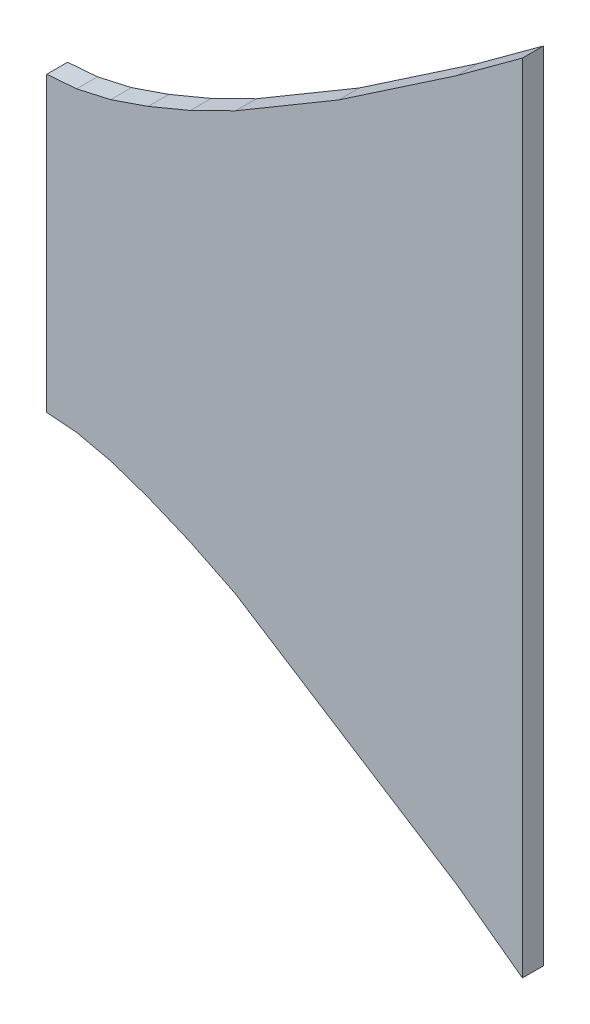
ISO-10303-21;
HEADER;
FILE_DESCRIPTION(('STEP AP214'),'2;1');
FILE_NAME('part.step','',(''),(''),'','','');
FILE_SCHEMA(('AUTOMOTIVE_DESIGN { 1 0 10303 214 1 1 1 1 }'));
ENDSEC;
DATA;
#1=APPLICATION_CONTEXT('core data for automotive mechanical design processes');
#2=APPLICATION_PROTOCOL_DEFINITION('international standard','automotive_design',2000,#1);
#3=PRODUCT_CONTEXT('',#1,'mechanical');
#4=PRODUCT('Part','Part','',(#3));
#5=PRODUCT_RELATED_PRODUCT_CATEGORY('part','',(#4));
#6=PRODUCT_DEFINITION_FORMATION('','',#4);
#7=PRODUCT_DEFINITION_CONTEXT('part definition',#1,'design');
#8=PRODUCT_DEFINITION('design','',#6,#7);
#9=PRODUCT_DEFINITION_SHAPE('','',#8);
#10=(LENGTH_UNIT() NAMED_UNIT(*) SI_UNIT(.MILLI.,.METRE.));
#11=(NAMED_UNIT(*) PLANE_ANGLE_UNIT() SI_UNIT($,.RADIAN.));
#12=(NAMED_UNIT(*) SI_UNIT($,.STERADIAN.) SOLID_ANGLE_UNIT());
#13=UNCERTAINTY_MEASURE_WITH_UNIT(LENGTH_MEASURE(1.E-05),#10,'distance_accuracy_value','');
#14=(GEOMETRIC_REPRESENTATION_CONTEXT(3) GLOBAL_UNCERTAINTY_ASSIGNED_CONTEXT((#13)) GLOBAL_UNIT_ASSIGNED_CONTEXT((#10,
#11,#12)) REPRESENTATION_CONTEXT('',''));
#15=CARTESIAN_POINT('',(0.,0.,0.));
#16=DIRECTION('',(0.,0.,1.));
#17=DIRECTION('',(1.,0.,0.));
#18=AXIS2_PLACEMENT_3D('',#15,#16,#17);
#19=CARTESIAN_POINT('',(115.977996826172,79.3099975585938,0.));
#20=DIRECTION('',(0.0781447450221444,0.996942023803503,0.));
#21=DIRECTION('',(0.996942023803503,-0.0781447450221444,0.));
#22=AXIS2_PLACEMENT_3D('',#19,#20,#21);
#23=PLANE('',#22);
#24=DIRECTION('',(0.996942023803503,-0.0781447450221444,0.));
#25=VECTOR('',#24,1.);
#26=CARTESIAN_POINT('',(115.977996826172,79.3099975585938,0.03556));
#27=LINE('',#26,#25);
#28=CARTESIAN_POINT('',(115.977996826172,79.3099975585938,0.03556));
#29=VERTEX_POINT('',#28);
#30=CARTESIAN_POINT('',(116.028999328613,79.3059997558594,0.03556));
#31=VERTEX_POINT('',#30);
#32=EDGE_CURVE('E11',#29,#31,#27,.T.);
#33=ORIENTED_EDGE('',*,*,#32,.F.);
#34=DIRECTION('',(0.,0.,1.));
#35=VECTOR('',#34,1.);
#36=CARTESIAN_POINT('',(115.977996826172,79.3099975585938,0.));
#37=LINE('',#36,#35);
#38=CARTESIAN_POINT('',(115.977996826172,79.3099975585938,0.));
#39=VERTEX_POINT('',#38);
#40=EDGE_CURVE('E24',#39,#29,#37,.T.);
#41=ORIENTED_EDGE('',*,*,#40,.F.);
#42=DIRECTION('',(0.996942023803503,-0.0781447450221444,0.));
#43=VECTOR('',#42,1.);
#44=CARTESIAN_POINT('',(115.977996826172,79.3099975585938,0.));
#45=LINE('',#44,#43);
#46=CARTESIAN_POINT('',(116.028999328613,79.3059997558594,0.));
#47=VERTEX_POINT('',#46);
#48=EDGE_CURVE('E154',#39,#47,#45,.T.);
#49=ORIENTED_EDGE('',*,*,#48,.T.);
#50=DIRECTION('',(0.,0.,1.));
#51=VECTOR('',#50,1.);
#52=CARTESIAN_POINT('',(116.028999328613,79.3059997558594,0.));
#53=LINE('',#52,#51);
#54=EDGE_CURVE('E37',#47,#31,#53,.T.);
#55=ORIENTED_EDGE('',*,*,#54,.T.);
#56=EDGE_LOOP('',(#33,#41,#49,#55));
#57=FACE_BOUND('',#56,.T.);
#58=ADVANCED_FACE('F17',(#57),#23,.F.);
#59=CARTESIAN_POINT('',(116.028999328613,79.3059997558594,0.));
#60=DIRECTION('',(0.218724100263412,0.97578674307656,0.));
#61=DIRECTION('',(0.97578674307656,-0.218724100263412,0.));
#62=AXIS2_PLACEMENT_3D('',#59,#60,#61);
#63=PLANE('',#62);
#64=DIRECTION('',(0.97578674307656,-0.218724100263412,0.));
#65=VECTOR('',#64,1.);
#66=CARTESIAN_POINT('',(116.028999328613,79.3059997558594,0.03556));
#67=LINE('',#66,#65);
#68=CARTESIAN_POINT('',(116.08699798584,79.2929992675781,0.03556));
#69=VERTEX_POINT('',#68);
#70=EDGE_CURVE('E266',#31,#69,#67,.T.);
#71=ORIENTED_EDGE('',*,*,#70,.F.);
#72=ORIENTED_EDGE('',*,*,#54,.F.);
#73=DIRECTION('',(0.97578674307656,-0.218724100263412,0.));
#74=VECTOR('',#73,1.);
#75=CARTESIAN_POINT('',(116.028999328613,79.3059997558594,0.));
#76=LINE('',#75,#74);
#77=CARTESIAN_POINT('',(116.08699798584,79.2929992675781,0.));
#78=VERTEX_POINT('',#77);
#79=EDGE_CURVE('E263',#47,#78,#76,.T.);
#80=ORIENTED_EDGE('',*,*,#79,.T.);
#81=DIRECTION('',(0.,0.,1.));
#82=VECTOR('',#81,1.);
#83=CARTESIAN_POINT('',(116.08699798584,79.2929992675781,0.));
#84=LINE('',#83,#82);
#85=EDGE_CURVE('E261',#78,#69,#84,.T.);
#86=ORIENTED_EDGE('',*,*,#85,.T.);
#87=EDGE_LOOP('',(#71,#72,#80,#86));
#88=FACE_BOUND('',#87,.T.);
#89=ADVANCED_FACE('F274',(#88),#63,.F.);
#90=CARTESIAN_POINT('',(116.08699798584,79.2929992675781,0.));
#91=DIRECTION('',(0.325007303806511,0.945711505942707,0.));
#92=DIRECTION('',(0.945711505942707,-0.325007303806511,0.));
#93=AXIS2_PLACEMENT_3D('',#90,#91,#92);
#94=PLANE('',#93);
#95=DIRECTION('',(0.945711505942707,-0.325007303806511,0.));
#96=VECTOR('',#95,1.);
#97=CARTESIAN_POINT('',(116.08699798584,79.2929992675781,0.03556));
#98=LINE('',#97,#96);
#99=CARTESIAN_POINT('',(116.151000976562,79.2710037231445,0.03556));
#100=VERTEX_POINT('',#99);
#101=EDGE_CURVE('E258',#69,#100,#98,.T.);
#102=ORIENTED_EDGE('',*,*,#101,.F.);
#103=ORIENTED_EDGE('',*,*,#85,.F.);
#104=DIRECTION('',(0.945711505942707,-0.325007303806511,0.));
#105=VECTOR('',#104,1.);
#106=CARTESIAN_POINT('',(116.08699798584,79.2929992675781,0.));
#107=LINE('',#106,#105);
#108=CARTESIAN_POINT('',(116.151000976562,79.2710037231445,0.));
#109=VERTEX_POINT('',#108);
#110=EDGE_CURVE('E255',#78,#109,#107,.T.);
#111=ORIENTED_EDGE('',*,*,#110,.T.);
#112=DIRECTION('',(0.,0.,1.));
#113=VECTOR('',#112,1.);
#114=CARTESIAN_POINT('',(116.151000976562,79.2710037231445,0.));
#115=LINE('',#114,#113);
#116=EDGE_CURVE('E253',#109,#100,#115,.T.);
#117=ORIENTED_EDGE('',*,*,#116,.T.);
#118=EDGE_LOOP('',(#102,#103,#111,#117));
#119=FACE_BOUND('',#118,.T.);
#120=ADVANCED_FACE('F280',(#119),#94,.F.);
#121=CARTESIAN_POINT('',(116.151000976562,79.2710037231445,0.));
#122=DIRECTION('',(0.384691780277399,0.923045087840787,0.));
#123=DIRECTION('',(0.923045087840787,-0.384691780277399,0.));
#124=AXIS2_PLACEMENT_3D('',#121,#122,#123);
#125=PLANE('',#124);
#126=DIRECTION('',(0.923045087840787,-0.384691780277399,0.));
#127=VECTOR('',#126,1.);
#128=CARTESIAN_POINT('',(116.151000976562,79.2710037231445,0.03556));
#129=LINE('',#128,#127);
#130=CARTESIAN_POINT('',(116.222999572754,79.2409973144531,0.03556));
#131=VERTEX_POINT('',#130);
#132=EDGE_CURVE('E250',#100,#131,#129,.T.);
#133=ORIENTED_EDGE('',*,*,#132,.F.);
#134=ORIENTED_EDGE('',*,*,#116,.F.);
#135=DIRECTION('',(0.923045087840787,-0.384691780277399,0.));
#136=VECTOR('',#135,1.);
#137=CARTESIAN_POINT('',(116.151000976562,79.2710037231445,0.));
#138=LINE('',#137,#136);
#139=CARTESIAN_POINT('',(116.222999572754,79.2409973144531,0.));
#140=VERTEX_POINT('',#139);
#141=EDGE_CURVE('E247',#109,#140,#138,.T.);
#142=ORIENTED_EDGE('',*,*,#141,.T.);
#143=DIRECTION('',(0.,0.,1.));
#144=VECTOR('',#143,1.);
#145=CARTESIAN_POINT('',(116.222999572754,79.2409973144531,0.));
#146=LINE('',#145,#144);
#147=EDGE_CURVE('E245',#140,#131,#146,.T.);
#148=ORIENTED_EDGE('',*,*,#147,.T.);
#149=EDGE_LOOP('',(#133,#134,#142,#148));
#150=FACE_BOUND('',#149,.T.);
#151=ADVANCED_FACE('F282',(#150),#125,.F.);
#152=CARTESIAN_POINT('',(116.222999572754,79.2409973144531,0.));
#153=DIRECTION('',(0.442480450642738,0.896778150268504,0.));
#154=DIRECTION('',(0.896778150268504,-0.442480450642738,0.));
#155=AXIS2_PLACEMENT_3D('',#152,#153,#154);
#156=PLANE('',#155);
#157=DIRECTION('',(0.896778150268504,-0.442480450642738,0.));
#158=VECTOR('',#157,1.);
#159=CARTESIAN_POINT('',(116.222999572754,79.2409973144531,0.03556));
#160=LINE('',#159,#158);
#161=CARTESIAN_POINT('',(116.300003051758,79.2030029296875,0.03556));
#162=VERTEX_POINT('',#161);
#163=EDGE_CURVE('E242',#131,#162,#160,.T.);
#164=ORIENTED_EDGE('',*,*,#163,.F.);
#165=ORIENTED_EDGE('',*,*,#147,.F.);
#166=DIRECTION('',(0.896778150268504,-0.442480450642738,0.));
#167=VECTOR('',#166,1.);
#168=CARTESIAN_POINT('',(116.222999572754,79.2409973144531,0.));
#169=LINE('',#168,#167);
#170=CARTESIAN_POINT('',(116.300003051758,79.2030029296875,0.));
#171=VERTEX_POINT('',#170);
#172=EDGE_CURVE('E239',#140,#171,#169,.T.);
#173=ORIENTED_EDGE('',*,*,#172,.T.);
#174=DIRECTION('',(0.,0.,1.));
#175=VECTOR('',#174,1.);
#176=CARTESIAN_POINT('',(116.300003051758,79.2030029296875,0.));
#177=LINE('',#176,#175);
#178=EDGE_CURVE('E237',#171,#162,#177,.T.);
#179=ORIENTED_EDGE('',*,*,#178,.T.);
#180=EDGE_LOOP('',(#164,#165,#173,#179));
#181=FACE_BOUND('',#180,.T.);
#182=ADVANCED_FACE('F287',(#181),#156,.F.);
#183=CARTESIAN_POINT('',(116.300003051758,79.2030029296875,0.));
#184=DIRECTION('',(0.537606497773678,0.843195857171702,0.));
#185=DIRECTION('',(0.843195857171701,-0.537606497773678,0.));
#186=AXIS2_PLACEMENT_3D('',#183,#184,#185);
#187=PLANE('',#186);
#188=DIRECTION('',(0.843195857171702,-0.537606497773678,0.));
#189=VECTOR('',#188,1.);
#190=CARTESIAN_POINT('',(116.300003051758,79.2030029296875,0.03556));
#191=LINE('',#190,#189);
#192=CARTESIAN_POINT('',(116.678001403809,78.9619979858398,0.03556));
#193=VERTEX_POINT('',#192);
#194=EDGE_CURVE('E234',#162,#193,#191,.T.);
#195=ORIENTED_EDGE('',*,*,#194,.F.);
#196=ORIENTED_EDGE('',*,*,#178,.F.);
#197=DIRECTION('',(0.843195857171702,-0.537606497773678,0.));
#198=VECTOR('',#197,1.);
#199=CARTESIAN_POINT('',(116.300003051758,79.2030029296875,0.));
#200=LINE('',#199,#198);
#201=CARTESIAN_POINT('',(116.678001403809,78.9619979858398,0.));
#202=VERTEX_POINT('',#201);
#203=EDGE_CURVE('E231',#171,#202,#200,.T.);
#204=ORIENTED_EDGE('',*,*,#203,.T.);
#205=DIRECTION('',(0.,0.,1.));
#206=VECTOR('',#205,1.);
#207=CARTESIAN_POINT('',(116.678001403809,78.9619979858398,0.));
#208=LINE('',#207,#206);
#209=EDGE_CURVE('E229',#202,#193,#208,.T.);
#210=ORIENTED_EDGE('',*,*,#209,.T.);
#211=EDGE_LOOP('',(#195,#196,#204,#210));
#212=FACE_BOUND('',#211,.T.);
#213=ADVANCED_FACE('F290',(#212),#187,.F.);
#214=CARTESIAN_POINT('',(116.678001403809,78.9619979858398,0.));
#215=DIRECTION('',(0.590743962247607,0.806859077576746,0.));
#216=DIRECTION('',(0.806859077576746,-0.590743962247607,0.));
#217=AXIS2_PLACEMENT_3D('',#214,#215,#216);
#218=PLANE('',#217);
#219=DIRECTION('',(0.806859077576746,-0.590743962247607,0.));
#220=VECTOR('',#219,1.);
#221=CARTESIAN_POINT('',(116.678001403809,78.9619979858398,0.03556));
#222=LINE('',#221,#220);
#223=CARTESIAN_POINT('',(116.790000915527,78.879997253418,0.03556));
#224=VERTEX_POINT('',#223);
#225=EDGE_CURVE('E226',#193,#224,#222,.T.);
#226=ORIENTED_EDGE('',*,*,#225,.F.);
#227=ORIENTED_EDGE('',*,*,#209,.F.);
#228=DIRECTION('',(0.806859077576746,-0.590743962247607,0.));
#229=VECTOR('',#228,1.);
#230=CARTESIAN_POINT('',(116.678001403809,78.9619979858398,0.));
#231=LINE('',#230,#229);
#232=CARTESIAN_POINT('',(116.790000915527,78.879997253418,0.));
#233=VERTEX_POINT('',#232);
#234=EDGE_CURVE('E223',#202,#233,#231,.T.);
#235=ORIENTED_EDGE('',*,*,#234,.T.);
#236=DIRECTION('',(0.,0.,1.));
#237=VECTOR('',#236,1.);
#238=CARTESIAN_POINT('',(116.790000915527,78.879997253418,0.));
#239=LINE('',#238,#237);
#240=EDGE_CURVE('E221',#233,#224,#239,.T.);
#241=ORIENTED_EDGE('',*,*,#240,.T.);
#242=EDGE_LOOP('',(#226,#227,#235,#241));
#243=FACE_BOUND('',#242,.T.);
#244=ADVANCED_FACE('F295',(#243),#218,.F.);
#245=CARTESIAN_POINT('',(116.790000915527,78.879997253418,0.));
#246=DIRECTION('',(-1.,0.,0.));
#247=DIRECTION('',(0.,1.,0.));
#248=AXIS2_PLACEMENT_3D('',#245,#246,#247);
#249=PLANE('',#248);
#250=DIRECTION('',(0.,1.,0.));
#251=VECTOR('',#250,1.);
#252=CARTESIAN_POINT('',(116.790000915527,78.879997253418,0.03556));
#253=LINE('',#252,#251);
#254=CARTESIAN_POINT('',(116.790000915527,80.2399978637695,0.03556));
#255=VERTEX_POINT('',#254);
#256=EDGE_CURVE('E218',#224,#255,#253,.T.);
#257=ORIENTED_EDGE('',*,*,#256,.F.);
#258=ORIENTED_EDGE('',*,*,#240,.F.);
#259=DIRECTION('',(0.,1.,0.));
#260=VECTOR('',#259,1.);
#261=CARTESIAN_POINT('',(116.790000915527,78.879997253418,0.));
#262=LINE('',#261,#260);
#263=CARTESIAN_POINT('',(116.790000915527,80.2399978637695,0.));
#264=VERTEX_POINT('',#263);
#265=EDGE_CURVE('E215',#233,#264,#262,.T.);
#266=ORIENTED_EDGE('',*,*,#265,.T.);
#267=DIRECTION('',(0.,0.,1.));
#268=VECTOR('',#267,1.);
#269=CARTESIAN_POINT('',(116.790000915527,80.2399978637695,0.));
#270=LINE('',#269,#268);
#271=EDGE_CURVE('E213',#264,#255,#270,.T.);
#272=ORIENTED_EDGE('',*,*,#271,.T.);
#273=EDGE_LOOP('',(#257,#258,#266,#272));
#274=FACE_BOUND('',#273,.T.);
#275=ADVANCED_FACE('F298',(#274),#249,.F.);
#276=CARTESIAN_POINT('',(116.790000915527,80.2399978637695,0.));
#277=DIRECTION('',(0.590743962247607,-0.806859077576746,0.));
#278=DIRECTION('',(-0.806859077576746,-0.590743962247607,0.));
#279=AXIS2_PLACEMENT_3D('',#276,#277,#278);
#280=PLANE('',#279);
#281=DIRECTION('',(-0.806859077576746,-0.590743962247607,0.));
#282=VECTOR('',#281,1.);
#283=CARTESIAN_POINT('',(116.790000915527,80.2399978637695,0.03556));
#284=LINE('',#283,#282);
#285=CARTESIAN_POINT('',(116.678001403809,80.1579971313477,0.03556));
#286=VERTEX_POINT('',#285);
#287=EDGE_CURVE('E210',#255,#286,#284,.T.);
#288=ORIENTED_EDGE('',*,*,#287,.F.);
#289=ORIENTED_EDGE('',*,*,#271,.F.);
#290=DIRECTION('',(-0.806859077576746,-0.590743962247607,0.));
#291=VECTOR('',#290,1.);
#292=CARTESIAN_POINT('',(116.790000915527,80.2399978637695,0.));
#293=LINE('',#292,#291);
#294=CARTESIAN_POINT('',(116.678001403809,80.1579971313477,0.));
#295=VERTEX_POINT('',#294);
#296=EDGE_CURVE('E207',#264,#295,#293,.T.);
#297=ORIENTED_EDGE('',*,*,#296,.T.);
#298=DIRECTION('',(0.,0.,1.));
#299=VECTOR('',#298,1.);
#300=CARTESIAN_POINT('',(116.678001403809,80.1579971313477,0.));
#301=LINE('',#300,#299);
#302=EDGE_CURVE('E205',#295,#286,#301,.T.);
#303=ORIENTED_EDGE('',*,*,#302,.T.);
#304=EDGE_LOOP('',(#288,#289,#297,#303));
#305=FACE_BOUND('',#304,.T.);
#306=ADVANCED_FACE('F303',(#305),#280,.F.);
#307=CARTESIAN_POINT('',(116.678001403809,80.1579971313477,0.));
#308=DIRECTION('',(0.561275900181253,-0.82762875969587,0.));
#309=DIRECTION('',(-0.82762875969587,-0.561275900181253,0.));
#310=AXIS2_PLACEMENT_3D('',#307,#308,#309);
#311=PLANE('',#310);
#312=DIRECTION('',(-0.82762875969587,-0.561275900181253,0.));
#313=VECTOR('',#312,1.);
#314=CARTESIAN_POINT('',(116.678001403809,80.1579971313477,0.03556));
#315=LINE('',#314,#313);
#316=CARTESIAN_POINT('',(116.475997924805,80.0210037231445,0.03556));
#317=VERTEX_POINT('',#316);
#318=EDGE_CURVE('E202',#286,#317,#315,.T.);
#319=ORIENTED_EDGE('',*,*,#318,.F.);
#320=ORIENTED_EDGE('',*,*,#302,.F.);
#321=DIRECTION('',(-0.82762875969587,-0.561275900181253,0.));
#322=VECTOR('',#321,1.);
#323=CARTESIAN_POINT('',(116.678001403809,80.1579971313477,0.));
#324=LINE('',#323,#322);
#325=CARTESIAN_POINT('',(116.475997924805,80.0210037231445,0.));
#326=VERTEX_POINT('',#325);
#327=EDGE_CURVE('E199',#295,#326,#324,.T.);
#328=ORIENTED_EDGE('',*,*,#327,.T.);
#329=DIRECTION('',(0.,0.,1.));
#330=VECTOR('',#329,1.);
#331=CARTESIAN_POINT('',(116.475997924805,80.0210037231445,0.));
#332=LINE('',#331,#330);
#333=EDGE_CURVE('E197',#326,#317,#332,.T.);
#334=ORIENTED_EDGE('',*,*,#333,.T.);
#335=EDGE_LOOP('',(#319,#320,#328,#334));
#336=FACE_BOUND('',#335,.T.);
#337=ADVANCED_FACE('F306',(#336),#311,.F.);
#338=CARTESIAN_POINT('',(116.475997924805,80.0210037231445,0.));
#339=DIRECTION('',(0.508754459023381,-0.860911668188919,0.));
#340=DIRECTION('',(-0.860911668188919,-0.508754459023381,0.));
#341=AXIS2_PLACEMENT_3D('',#338,#339,#340);
#342=PLANE('',#341);
#343=DIRECTION('',(-0.860911668188919,-0.508754459023381,0.));
#344=VECTOR('',#343,1.);
#345=CARTESIAN_POINT('',(116.475997924805,80.0210037231445,0.03556));
#346=LINE('',#345,#344);
#347=CARTESIAN_POINT('',(116.300003051758,79.9169998168945,0.03556));
#348=VERTEX_POINT('',#347);
#349=EDGE_CURVE('E194',#317,#348,#346,.T.);
#350=ORIENTED_EDGE('',*,*,#349,.F.);
#351=ORIENTED_EDGE('',*,*,#333,.F.);
#352=DIRECTION('',(-0.860911668188919,-0.508754459023381,0.));
#353=VECTOR('',#352,1.);
#354=CARTESIAN_POINT('',(116.475997924805,80.0210037231445,0.));
#355=LINE('',#354,#353);
#356=CARTESIAN_POINT('',(116.300003051758,79.9169998168945,0.));
#357=VERTEX_POINT('',#356);
#358=EDGE_CURVE('E191',#326,#357,#355,.T.);
#359=ORIENTED_EDGE('',*,*,#358,.T.);
#360=DIRECTION('',(0.,0.,1.));
#361=VECTOR('',#360,1.);
#362=CARTESIAN_POINT('',(116.300003051758,79.9169998168945,0.));
#363=LINE('',#362,#361);
#364=EDGE_CURVE('E189',#357,#348,#363,.T.);
#365=ORIENTED_EDGE('',*,*,#364,.T.);
#366=EDGE_LOOP('',(#350,#351,#359,#365));
#367=FACE_BOUND('',#366,.T.);
#368=ADVANCED_FACE('F311',(#367),#342,.F.);
#369=CARTESIAN_POINT('',(116.300003051758,79.9169998168945,0.));
#370=DIRECTION('',(0.44255190178388,-0.896742891930274,0.));
#371=DIRECTION('',(-0.896742891930274,-0.44255190178388,0.));
#372=AXIS2_PLACEMENT_3D('',#369,#370,#371);
#373=PLANE('',#372);
#374=DIRECTION('',(-0.896742891930274,-0.44255190178388,0.));
#375=VECTOR('',#374,1.);
#376=CARTESIAN_POINT('',(116.300003051758,79.9169998168945,0.03556));
#377=LINE('',#376,#375);
#378=CARTESIAN_POINT('',(116.222999572754,79.8789978027344,0.03556));
#379=VERTEX_POINT('',#378);
#380=EDGE_CURVE('E186',#348,#379,#377,.T.);
#381=ORIENTED_EDGE('',*,*,#380,.F.);
#382=ORIENTED_EDGE('',*,*,#364,.F.);
#383=DIRECTION('',(-0.896742891930274,-0.44255190178388,0.));
#384=VECTOR('',#383,1.);
#385=CARTESIAN_POINT('',(116.300003051758,79.9169998168945,0.));
#386=LINE('',#385,#384);
#387=CARTESIAN_POINT('',(116.222999572754,79.8789978027344,0.));
#388=VERTEX_POINT('',#387);
#389=EDGE_CURVE('E183',#357,#388,#386,.T.);
#390=ORIENTED_EDGE('',*,*,#389,.T.);
#391=DIRECTION('',(0.,0.,1.));
#392=VECTOR('',#391,1.);
#393=CARTESIAN_POINT('',(116.222999572754,79.8789978027344,0.));
#394=LINE('',#393,#392);
#395=EDGE_CURVE('E181',#388,#379,#394,.T.);
#396=ORIENTED_EDGE('',*,*,#395,.T.);
#397=EDGE_LOOP('',(#381,#382,#390,#396));
#398=FACE_BOUND('',#397,.T.);
#399=ADVANCED_FACE('F314',(#398),#373,.F.);
#400=CARTESIAN_POINT('',(116.222999572754,79.8789978027344,0.));
#401=DIRECTION('',(0.384608439163254,-0.923079816984645,0.));
#402=DIRECTION('',(-0.923079816984645,-0.384608439163254,0.));
#403=AXIS2_PLACEMENT_3D('',#400,#401,#402);
#404=PLANE('',#403);
#405=DIRECTION('',(-0.923079816984645,-0.384608439163254,0.));
#406=VECTOR('',#405,1.);
#407=CARTESIAN_POINT('',(116.222999572754,79.8789978027344,0.03556));
#408=LINE('',#407,#406);
#409=CARTESIAN_POINT('',(116.151000976562,79.8489990234375,0.03556));
#410=VERTEX_POINT('',#409);
#411=EDGE_CURVE('E178',#379,#410,#408,.T.);
#412=ORIENTED_EDGE('',*,*,#411,.F.);
#413=ORIENTED_EDGE('',*,*,#395,.F.);
#414=DIRECTION('',(-0.923079816984645,-0.384608439163254,0.));
#415=VECTOR('',#414,1.);
#416=CARTESIAN_POINT('',(116.222999572754,79.8789978027344,0.));
#417=LINE('',#416,#415);
#418=CARTESIAN_POINT('',(116.151000976562,79.8489990234375,0.));
#419=VERTEX_POINT('',#418);
#420=EDGE_CURVE('E175',#388,#419,#417,.T.);
#421=ORIENTED_EDGE('',*,*,#420,.T.);
#422=DIRECTION('',(0.,0.,1.));
#423=VECTOR('',#422,1.);
#424=CARTESIAN_POINT('',(116.151000976562,79.8489990234375,0.));
#425=LINE('',#424,#423);
#426=EDGE_CURVE('E173',#419,#410,#425,.T.);
#427=ORIENTED_EDGE('',*,*,#426,.T.);
#428=EDGE_LOOP('',(#412,#413,#421,#427));
#429=FACE_BOUND('',#428,.T.);
#430=ADVANCED_FACE('F319',(#429),#404,.F.);
#431=CARTESIAN_POINT('',(116.151000976562,79.8489990234375,0.));
#432=DIRECTION('',(0.325007303806511,-0.945711505942707,0.));
#433=DIRECTION('',(-0.945711505942707,-0.325007303806511,0.));
#434=AXIS2_PLACEMENT_3D('',#431,#432,#433);
#435=PLANE('',#434);
#436=DIRECTION('',(-0.945711505942707,-0.325007303806511,0.));
#437=VECTOR('',#436,1.);
#438=CARTESIAN_POINT('',(116.151000976562,79.8489990234375,0.03556));
#439=LINE('',#438,#437);
#440=CARTESIAN_POINT('',(116.08699798584,79.8270034790039,0.03556));
#441=VERTEX_POINT('',#440);
#442=EDGE_CURVE('E170',#410,#441,#439,.T.);
#443=ORIENTED_EDGE('',*,*,#442,.F.);
#444=ORIENTED_EDGE('',*,*,#426,.F.);
#445=DIRECTION('',(-0.945711505942707,-0.325007303806511,0.));
#446=VECTOR('',#445,1.);
#447=CARTESIAN_POINT('',(116.151000976562,79.8489990234375,0.));
#448=LINE('',#447,#446);
#449=CARTESIAN_POINT('',(116.08699798584,79.8270034790039,0.));
#450=VERTEX_POINT('',#449);
#451=EDGE_CURVE('E167',#419,#450,#448,.T.);
#452=ORIENTED_EDGE('',*,*,#451,.T.);
#453=DIRECTION('',(0.,0.,1.));
#454=VECTOR('',#453,1.);
#455=CARTESIAN_POINT('',(116.08699798584,79.8270034790039,0.));
#456=LINE('',#455,#454);
#457=EDGE_CURVE('E165',#450,#441,#456,.T.);
#458=ORIENTED_EDGE('',*,*,#457,.T.);
#459=EDGE_LOOP('',(#443,#444,#452,#458));
#460=FACE_BOUND('',#459,.T.);
#461=ADVANCED_FACE('F322',(#460),#435,.F.);
#462=CARTESIAN_POINT('',(116.08699798584,79.8270034790039,0.));
#463=DIRECTION('',(0.218724100263412,-0.97578674307656,0.));
#464=DIRECTION('',(-0.97578674307656,-0.218724100263412,0.));
#465=AXIS2_PLACEMENT_3D('',#462,#463,#464);
#466=PLANE('',#465);
#467=DIRECTION('',(-0.97578674307656,-0.218724100263412,0.));
#468=VECTOR('',#467,1.);
#469=CARTESIAN_POINT('',(116.08699798584,79.8270034790039,0.03556));
#470=LINE('',#469,#468);
#471=CARTESIAN_POINT('',(116.028999328613,79.8140029907227,0.03556));
#472=VERTEX_POINT('',#471);
#473=EDGE_CURVE('E162',#441,#472,#470,.T.);
#474=ORIENTED_EDGE('',*,*,#473,.F.);
#475=ORIENTED_EDGE('',*,*,#457,.F.);
#476=DIRECTION('',(-0.97578674307656,-0.218724100263412,0.));
#477=VECTOR('',#476,1.);
#478=CARTESIAN_POINT('',(116.08699798584,79.8270034790039,0.));
#479=LINE('',#478,#477);
#480=CARTESIAN_POINT('',(116.028999328613,79.8140029907227,0.));
#481=VERTEX_POINT('',#480);
#482=EDGE_CURVE('E160',#450,#481,#479,.T.);
#483=ORIENTED_EDGE('',*,*,#482,.T.);
#484=DIRECTION('',(0.,0.,1.));
#485=VECTOR('',#484,1.);
#486=CARTESIAN_POINT('',(116.028999328613,79.8140029907227,0.));
#487=LINE('',#486,#485);
#488=EDGE_CURVE('E145',#481,#472,#487,.T.);
#489=ORIENTED_EDGE('',*,*,#488,.T.);
#490=EDGE_LOOP('',(#474,#475,#483,#489));
#491=FACE_BOUND('',#490,.T.);
#492=ADVANCED_FACE('F325',(#491),#466,.F.);
#493=CARTESIAN_POINT('',(116.028999328613,79.8140029907227,0.));
#494=DIRECTION('',(0.0782929629376174,-0.996930394738995,0.));
#495=DIRECTION('',(-0.996930394738995,-0.0782929629376174,0.));
#496=AXIS2_PLACEMENT_3D('',#493,#494,#495);
#497=PLANE('',#496);
#498=DIRECTION('',(-0.996930394738995,-0.0782929629376174,0.));
#499=VECTOR('',#498,1.);
#500=CARTESIAN_POINT('',(116.028999328613,79.8140029907227,0.03556));
#501=LINE('',#500,#499);
#502=CARTESIAN_POINT('',(115.977996826172,79.8099975585938,0.03556));
#503=VERTEX_POINT('',#502);
#504=EDGE_CURVE('E149',#472,#503,#501,.T.);
#505=ORIENTED_EDGE('',*,*,#504,.F.);
#506=ORIENTED_EDGE('',*,*,#488,.F.);
#507=DIRECTION('',(-0.996930394738995,-0.0782929629376174,0.));
#508=VECTOR('',#507,1.);
#509=CARTESIAN_POINT('',(116.028999328613,79.8140029907227,0.));
#510=LINE('',#509,#508);
#511=CARTESIAN_POINT('',(115.977996826172,79.8099975585938,0.));
#512=VERTEX_POINT('',#511);
#513=EDGE_CURVE('E141',#481,#512,#510,.T.);
#514=ORIENTED_EDGE('',*,*,#513,.T.);
#515=DIRECTION('',(0.,0.,1.));
#516=VECTOR('',#515,1.);
#517=CARTESIAN_POINT('',(115.977996826172,79.8099975585938,0.));
#518=LINE('',#517,#516);
#519=EDGE_CURVE('E131',#512,#503,#518,.T.);
#520=ORIENTED_EDGE('',*,*,#519,.T.);
#521=EDGE_LOOP('',(#505,#506,#514,#520));
#522=FACE_BOUND('',#521,.T.);
#523=ADVANCED_FACE('F144',(#522),#497,.F.);
#524=CARTESIAN_POINT('',(115.977996826172,79.8099975585938,0.));
#525=DIRECTION('',(1.,0.,0.));
#526=DIRECTION('',(0.,-1.,0.));
#527=AXIS2_PLACEMENT_3D('',#524,#525,#526);
#528=PLANE('',#527);
#529=DIRECTION('',(0.,-1.,0.));
#530=VECTOR('',#529,1.);
#531=CARTESIAN_POINT('',(115.977996826172,79.8099975585938,0.03556));
#532=LINE('',#531,#530);
#533=EDGE_CURVE('E137',#503,#29,#532,.T.);
#534=ORIENTED_EDGE('',*,*,#533,.F.);
#535=ORIENTED_EDGE('',*,*,#519,.F.);
#536=DIRECTION('',(0.,-1.,0.));
#537=VECTOR('',#536,1.);
#538=CARTESIAN_POINT('',(115.977996826172,79.8099975585938,0.));
#539=LINE('',#538,#537);
#540=EDGE_CURVE('E135',#512,#39,#539,.T.);
#541=ORIENTED_EDGE('',*,*,#540,.T.);
#542=ORIENTED_EDGE('',*,*,#40,.T.);
#543=EDGE_LOOP('',(#534,#535,#541,#542));
#544=FACE_BOUND('',#543,.T.);
#545=ADVANCED_FACE('F133',(#544),#528,.F.);
#546=CARTESIAN_POINT('',(115.977996826172,79.3099975585938,0.));
#547=DIRECTION('',(0.,0.,1.));
#548=DIRECTION('',(1.,0.,0.));
#549=AXIS2_PLACEMENT_3D('',#546,#547,#548);
#550=PLANE('',#549);
#551=ORIENTED_EDGE('',*,*,#540,.F.);
#552=ORIENTED_EDGE('',*,*,#513,.F.);
#553=ORIENTED_EDGE('',*,*,#482,.F.);
#554=ORIENTED_EDGE('',*,*,#451,.F.);
#555=ORIENTED_EDGE('',*,*,#420,.F.);
#556=ORIENTED_EDGE('',*,*,#389,.F.);
#557=ORIENTED_EDGE('',*,*,#358,.F.);
#558=ORIENTED_EDGE('',*,*,#327,.F.);
#559=ORIENTED_EDGE('',*,*,#296,.F.);
#560=ORIENTED_EDGE('',*,*,#265,.F.);
#561=ORIENTED_EDGE('',*,*,#234,.F.);
#562=ORIENTED_EDGE('',*,*,#203,.F.);
#563=ORIENTED_EDGE('',*,*,#172,.F.);
#564=ORIENTED_EDGE('',*,*,#141,.F.);
#565=ORIENTED_EDGE('',*,*,#110,.F.);
#566=ORIENTED_EDGE('',*,*,#79,.F.);
#567=ORIENTED_EDGE('',*,*,#48,.F.);
#568=EDGE_LOOP('',(#551,#552,#553,#554,#555,#556,#557,#558,#559,#560,#561,#562,#563,#564,#565,
#566,#567));
#569=FACE_BOUND('',#568,.T.);
#570=ADVANCED_FACE('F152',(#569),#550,.F.);
#571=CARTESIAN_POINT('',(115.977996826172,79.3099975585938,0.03556));
#572=DIRECTION('',(0.,0.,1.));
#573=DIRECTION('',(1.,0.,0.));
#574=AXIS2_PLACEMENT_3D('',#571,#572,#573);
#575=PLANE('',#574);
#576=ORIENTED_EDGE('',*,*,#32,.T.);
#577=ORIENTED_EDGE('',*,*,#70,.T.);
#578=ORIENTED_EDGE('',*,*,#101,.T.);
#579=ORIENTED_EDGE('',*,*,#132,.T.);
#580=ORIENTED_EDGE('',*,*,#163,.T.);
#581=ORIENTED_EDGE('',*,*,#194,.T.);
#582=ORIENTED_EDGE('',*,*,#225,.T.);
#583=ORIENTED_EDGE('',*,*,#256,.T.);
#584=ORIENTED_EDGE('',*,*,#287,.T.);
#585=ORIENTED_EDGE('',*,*,#318,.T.);
#586=ORIENTED_EDGE('',*,*,#349,.T.);
#587=ORIENTED_EDGE('',*,*,#380,.T.);
#588=ORIENTED_EDGE('',*,*,#411,.T.);
#589=ORIENTED_EDGE('',*,*,#442,.T.);
#590=ORIENTED_EDGE('',*,*,#473,.T.);
#591=ORIENTED_EDGE('',*,*,#504,.T.);
#592=ORIENTED_EDGE('',*,*,#533,.T.);
#593=EDGE_LOOP('',(#576,#577,#578,#579,#580,#581,#582,#583,#584,#585,#586,#587,#588,#589,#590,
#591,#592));
#594=FACE_BOUND('',#593,.T.);
#595=ADVANCED_FACE('F277',(#594),#575,.T.);
#596=CLOSED_SHELL('',(#58,#89,#120,#151,#182,#213,#244,#275,#306,#337,#368,#399,#430,#461,#492,
#523,#545,#570,#595));
#597=MANIFOLD_SOLID_BREP('B1',#596);
#598=ADVANCED_BREP_SHAPE_REPRESENTATION('',(#18,#597),#14);
#599=SHAPE_DEFINITION_REPRESENTATION(#9,#598);
ENDSEC;
END-ISO-10303-21;
